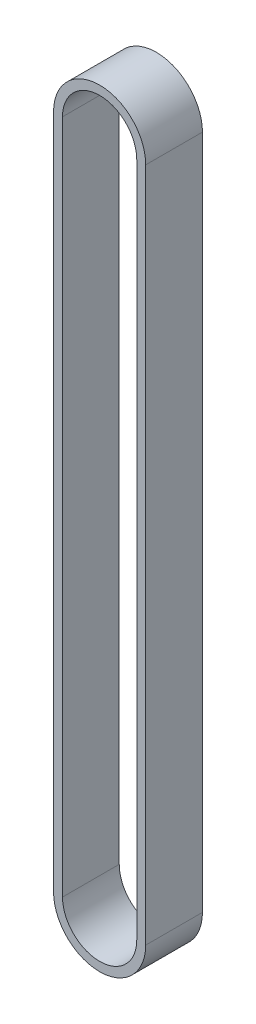
ISO-10303-21;
HEADER;
FILE_DESCRIPTION(('STEP AP214'),'2;1');
FILE_NAME('part.step','',(''),(''),'','','');
FILE_SCHEMA(('AUTOMOTIVE_DESIGN { 1 0 10303 214 1 1 1 1 }'));
ENDSEC;
DATA;
#1=APPLICATION_CONTEXT('core data for automotive mechanical design processes');
#2=APPLICATION_PROTOCOL_DEFINITION('international standard','automotive_design',2000,#1);
#3=PRODUCT_CONTEXT('',#1,'mechanical');
#4=PRODUCT('Part','Part','',(#3));
#5=PRODUCT_RELATED_PRODUCT_CATEGORY('part','',(#4));
#6=PRODUCT_DEFINITION_FORMATION('','',#4);
#7=PRODUCT_DEFINITION_CONTEXT('part definition',#1,'design');
#8=PRODUCT_DEFINITION('design','',#6,#7);
#9=PRODUCT_DEFINITION_SHAPE('','',#8);
#10=(LENGTH_UNIT() NAMED_UNIT(*) SI_UNIT(.MILLI.,.METRE.));
#11=(NAMED_UNIT(*) PLANE_ANGLE_UNIT() SI_UNIT($,.RADIAN.));
#12=(NAMED_UNIT(*) SI_UNIT($,.STERADIAN.) SOLID_ANGLE_UNIT());
#13=UNCERTAINTY_MEASURE_WITH_UNIT(LENGTH_MEASURE(1.E-05),#10,'distance_accuracy_value','');
#14=(GEOMETRIC_REPRESENTATION_CONTEXT(3) GLOBAL_UNCERTAINTY_ASSIGNED_CONTEXT((#13)) GLOBAL_UNIT_ASSIGNED_CONTEXT((#10,
#11,#12)) REPRESENTATION_CONTEXT('',''));
#15=CARTESIAN_POINT('',(0.,0.,0.));
#16=DIRECTION('',(0.,0.,1.));
#17=DIRECTION('',(1.,0.,0.));
#18=AXIS2_PLACEMENT_3D('',#15,#16,#17);
#19=CARTESIAN_POINT('',(0.,-113.143764563875,19.));
#20=DIRECTION('',(0.,0.,1.));
#21=DIRECTION('',(1.,0.,0.));
#22=AXIS2_PLACEMENT_3D('',#19,#20,#21);
#23=PLANE('',#22);
#24=CARTESIAN_POINT('',(0.,-113.143764563875,19.));
#25=DIRECTION('',(0.,0.,1.));
#26=DIRECTION('',(1.,0.,0.));
#27=AXIS2_PLACEMENT_3D('',#24,#25,#26);
#28=CIRCLE('',#27,15.4333);
#29=CARTESIAN_POINT('',(-15.4333,-113.143764563875,19.));
#30=VERTEX_POINT('',#29);
#31=CARTESIAN_POINT('',(15.4333,-113.143764563875,19.));
#32=VERTEX_POINT('',#31);
#33=EDGE_CURVE('E156',#30,#32,#28,.T.);
#34=ORIENTED_EDGE('',*,*,#33,.T.);
#35=DIRECTION('',(0.,1.,0.));
#36=VECTOR('',#35,1.);
#37=CARTESIAN_POINT('',(15.4333,-113.143764563875,19.));
#38=LINE('',#37,#36);
#39=CARTESIAN_POINT('',(15.4333,113.143764563875,19.));
#40=VERTEX_POINT('',#39);
#41=EDGE_CURVE('E160',#32,#40,#38,.T.);
#42=ORIENTED_EDGE('',*,*,#41,.T.);
#43=CARTESIAN_POINT('',(0.,113.143764563875,19.));
#44=DIRECTION('',(0.,0.,1.));
#45=DIRECTION('',(1.,0.,0.));
#46=AXIS2_PLACEMENT_3D('',#43,#44,#45);
#47=CIRCLE('',#46,15.4333);
#48=CARTESIAN_POINT('',(-15.4333,113.143764563875,19.));
#49=VERTEX_POINT('',#48);
#50=EDGE_CURVE('E164',#40,#49,#47,.T.);
#51=ORIENTED_EDGE('',*,*,#50,.T.);
#52=DIRECTION('',(0.,-1.,0.));
#53=VECTOR('',#52,1.);
#54=CARTESIAN_POINT('',(-15.4333,-113.143764563875,19.));
#55=LINE('',#54,#53);
#56=EDGE_CURVE('E167',#49,#30,#55,.T.);
#57=ORIENTED_EDGE('',*,*,#56,.T.);
#58=EDGE_LOOP('',(#34,#42,#51,#57));
#59=FACE_BOUND('',#58,.T.);
#60=DIRECTION('',(0.,1.,0.));
#61=VECTOR('',#60,1.);
#62=CARTESIAN_POINT('',(12.4333,-113.143764563875,19.));
#63=LINE('',#62,#61);
#64=CARTESIAN_POINT('',(12.4333,-113.143764563875,19.));
#65=VERTEX_POINT('',#64);
#66=CARTESIAN_POINT('',(12.4333,113.143764563875,19.));
#67=VERTEX_POINT('',#66);
#68=EDGE_CURVE('E115',#65,#67,#63,.T.);
#69=ORIENTED_EDGE('',*,*,#68,.F.);
#70=CARTESIAN_POINT('',(0.,-113.143764563875,19.));
#71=DIRECTION('',(0.,0.,1.));
#72=DIRECTION('',(1.,0.,0.));
#73=AXIS2_PLACEMENT_3D('',#70,#71,#72);
#74=CIRCLE('',#73,12.4333);
#75=CARTESIAN_POINT('',(-12.4333,-113.143764563875,19.));
#76=VERTEX_POINT('',#75);
#77=EDGE_CURVE('E106',#76,#65,#74,.T.);
#78=ORIENTED_EDGE('',*,*,#77,.F.);
#79=DIRECTION('',(0.,-1.,0.));
#80=VECTOR('',#79,1.);
#81=CARTESIAN_POINT('',(-12.4333,-113.143764563875,19.));
#82=LINE('',#81,#80);
#83=CARTESIAN_POINT('',(-12.4333000000001,113.143764563875,19.));
#84=VERTEX_POINT('',#83);
#85=EDGE_CURVE('E134',#84,#76,#82,.T.);
#86=ORIENTED_EDGE('',*,*,#85,.F.);
#87=CARTESIAN_POINT('',(0.,113.143764563875,19.));
#88=DIRECTION('',(0.,0.,1.));
#89=DIRECTION('',(1.,0.,0.));
#90=AXIS2_PLACEMENT_3D('',#87,#88,#89);
#91=CIRCLE('',#90,12.4333);
#92=EDGE_CURVE('E128',#67,#84,#91,.T.);
#93=ORIENTED_EDGE('',*,*,#92,.F.);
#94=EDGE_LOOP('',(#69,#78,#86,#93));
#95=FACE_BOUND('',#94,.T.);
#96=ADVANCED_FACE('F40',(#59,#95),#23,.T.);
#97=CARTESIAN_POINT('',(0.,-113.143764563875,0.));
#98=DIRECTION('',(0.,0.,1.));
#99=DIRECTION('',(1.,0.,0.));
#100=AXIS2_PLACEMENT_3D('',#97,#98,#99);
#101=PLANE('',#100);
#102=CARTESIAN_POINT('',(0.,-113.143764563875,0.));
#103=DIRECTION('',(0.,0.,1.));
#104=DIRECTION('',(1.,0.,0.));
#105=AXIS2_PLACEMENT_3D('',#102,#103,#104);
#106=CIRCLE('',#105,15.4333);
#107=CARTESIAN_POINT('',(-15.4333,-113.143764563875,0.));
#108=VERTEX_POINT('',#107);
#109=CARTESIAN_POINT('',(15.4333,-113.143764563875,0.));
#110=VERTEX_POINT('',#109);
#111=EDGE_CURVE('E124',#108,#110,#106,.T.);
#112=ORIENTED_EDGE('',*,*,#111,.F.);
#113=DIRECTION('',(0.,-1.,0.));
#114=VECTOR('',#113,1.);
#115=CARTESIAN_POINT('',(-15.4333,-113.143764563875,0.));
#116=LINE('',#115,#114);
#117=CARTESIAN_POINT('',(-15.4333,113.143764563875,0.));
#118=VERTEX_POINT('',#117);
#119=EDGE_CURVE('E161',#118,#108,#116,.T.);
#120=ORIENTED_EDGE('',*,*,#119,.F.);
#121=CARTESIAN_POINT('',(0.,113.143764563875,0.));
#122=DIRECTION('',(0.,0.,1.));
#123=DIRECTION('',(1.,0.,0.));
#124=AXIS2_PLACEMENT_3D('',#121,#122,#123);
#125=CIRCLE('',#124,15.4333);
#126=CARTESIAN_POINT('',(15.4333,113.143764563875,0.));
#127=VERTEX_POINT('',#126);
#128=EDGE_CURVE('E176',#127,#118,#125,.T.);
#129=ORIENTED_EDGE('',*,*,#128,.F.);
#130=DIRECTION('',(0.,1.,0.));
#131=VECTOR('',#130,1.);
#132=CARTESIAN_POINT('',(15.4333,-113.143764563875,0.));
#133=LINE('',#132,#131);
#134=EDGE_CURVE('E174',#110,#127,#133,.T.);
#135=ORIENTED_EDGE('',*,*,#134,.F.);
#136=EDGE_LOOP('',(#112,#120,#129,#135));
#137=FACE_BOUND('',#136,.T.);
#138=CARTESIAN_POINT('',(0.,-113.143764563875,0.));
#139=DIRECTION('',(0.,0.,1.));
#140=DIRECTION('',(1.,0.,0.));
#141=AXIS2_PLACEMENT_3D('',#138,#139,#140);
#142=CIRCLE('',#141,12.4333);
#143=CARTESIAN_POINT('',(-12.4333,-113.143764563875,0.));
#144=VERTEX_POINT('',#143);
#145=CARTESIAN_POINT('',(12.4333,-113.143764563875,0.));
#146=VERTEX_POINT('',#145);
#147=EDGE_CURVE('E64',#144,#146,#142,.T.);
#148=ORIENTED_EDGE('',*,*,#147,.T.);
#149=DIRECTION('',(0.,1.,0.));
#150=VECTOR('',#149,1.);
#151=CARTESIAN_POINT('',(12.4333,-113.143764563875,0.));
#152=LINE('',#151,#150);
#153=CARTESIAN_POINT('',(12.4333,113.143764563875,0.));
#154=VERTEX_POINT('',#153);
#155=EDGE_CURVE('E122',#146,#154,#152,.T.);
#156=ORIENTED_EDGE('',*,*,#155,.T.);
#157=CARTESIAN_POINT('',(0.,113.143764563875,0.));
#158=DIRECTION('',(0.,0.,1.));
#159=DIRECTION('',(1.,0.,0.));
#160=AXIS2_PLACEMENT_3D('',#157,#158,#159);
#161=CIRCLE('',#160,12.4333);
#162=CARTESIAN_POINT('',(-12.4333000000001,113.143764563875,0.));
#163=VERTEX_POINT('',#162);
#164=EDGE_CURVE('E143',#154,#163,#161,.T.);
#165=ORIENTED_EDGE('',*,*,#164,.T.);
#166=DIRECTION('',(0.,-1.,0.));
#167=VECTOR('',#166,1.);
#168=CARTESIAN_POINT('',(-12.4333,-113.143764563875,0.));
#169=LINE('',#168,#167);
#170=EDGE_CURVE('E116',#163,#144,#169,.T.);
#171=ORIENTED_EDGE('',*,*,#170,.T.);
#172=EDGE_LOOP('',(#148,#156,#165,#171));
#173=FACE_BOUND('',#172,.T.);
#174=ADVANCED_FACE('F198',(#137,#173),#101,.F.);
#175=CARTESIAN_POINT('',(0.,-113.143764563875,19.));
#176=DIRECTION('',(0.,0.,-1.));
#177=DIRECTION('',(-1.,0.,0.));
#178=AXIS2_PLACEMENT_3D('',#175,#176,#177);
#179=CYLINDRICAL_SURFACE('',#178,15.4333);
#180=ORIENTED_EDGE('',*,*,#111,.T.);
#181=DIRECTION('',(0.,0.,-1.));
#182=VECTOR('',#181,1.);
#183=CARTESIAN_POINT('',(15.4333,-113.143764563875,19.));
#184=LINE('',#183,#182);
#185=EDGE_CURVE('E11',#32,#110,#184,.T.);
#186=ORIENTED_EDGE('',*,*,#185,.F.);
#187=ORIENTED_EDGE('',*,*,#33,.F.);
#188=DIRECTION('',(0.,0.,-1.));
#189=VECTOR('',#188,1.);
#190=CARTESIAN_POINT('',(-15.4333,-113.143764563875,19.));
#191=LINE('',#190,#189);
#192=EDGE_CURVE('E170',#30,#108,#191,.T.);
#193=ORIENTED_EDGE('',*,*,#192,.T.);
#194=EDGE_LOOP('',(#180,#186,#187,#193));
#195=FACE_BOUND('',#194,.T.);
#196=ADVANCED_FACE('F42',(#195),#179,.T.);
#197=CARTESIAN_POINT('',(15.4333,-113.143764563875,19.));
#198=DIRECTION('',(-1.,0.,0.));
#199=DIRECTION('',(0.,0.,1.));
#200=AXIS2_PLACEMENT_3D('',#197,#198,#199);
#201=PLANE('',#200);
#202=ORIENTED_EDGE('',*,*,#134,.T.);
#203=DIRECTION('',(0.,0.,-1.));
#204=VECTOR('',#203,1.);
#205=CARTESIAN_POINT('',(15.4333,113.143764563875,19.));
#206=LINE('',#205,#204);
#207=EDGE_CURVE('E49',#40,#127,#206,.T.);
#208=ORIENTED_EDGE('',*,*,#207,.F.);
#209=ORIENTED_EDGE('',*,*,#41,.F.);
#210=ORIENTED_EDGE('',*,*,#185,.T.);
#211=EDGE_LOOP('',(#202,#208,#209,#210));
#212=FACE_BOUND('',#211,.T.);
#213=ADVANCED_FACE('F208',(#212),#201,.F.);
#214=CARTESIAN_POINT('',(0.,113.143764563875,19.));
#215=DIRECTION('',(0.,0.,-1.));
#216=DIRECTION('',(-1.,0.,0.));
#217=AXIS2_PLACEMENT_3D('',#214,#215,#216);
#218=CYLINDRICAL_SURFACE('',#217,15.4333);
#219=ORIENTED_EDGE('',*,*,#128,.T.);
#220=DIRECTION('',(0.,0.,-1.));
#221=VECTOR('',#220,1.);
#222=CARTESIAN_POINT('',(-15.4333,113.143764563875,19.));
#223=LINE('',#222,#221);
#224=EDGE_CURVE('E183',#49,#118,#223,.T.);
#225=ORIENTED_EDGE('',*,*,#224,.F.);
#226=ORIENTED_EDGE('',*,*,#50,.F.);
#227=ORIENTED_EDGE('',*,*,#207,.T.);
#228=EDGE_LOOP('',(#219,#225,#226,#227));
#229=FACE_BOUND('',#228,.T.);
#230=ADVANCED_FACE('F192',(#229),#218,.T.);
#231=CARTESIAN_POINT('',(-15.4333,-113.143764563875,19.));
#232=DIRECTION('',(1.,0.,0.));
#233=DIRECTION('',(0.,0.,-1.));
#234=AXIS2_PLACEMENT_3D('',#231,#232,#233);
#235=PLANE('',#234);
#236=ORIENTED_EDGE('',*,*,#119,.T.);
#237=ORIENTED_EDGE('',*,*,#192,.F.);
#238=ORIENTED_EDGE('',*,*,#56,.F.);
#239=ORIENTED_EDGE('',*,*,#224,.T.);
#240=EDGE_LOOP('',(#236,#237,#238,#239));
#241=FACE_BOUND('',#240,.T.);
#242=ADVANCED_FACE('F202',(#241),#235,.F.);
#243=CARTESIAN_POINT('',(0.,-113.143764563875,19.));
#244=DIRECTION('',(0.,0.,-1.));
#245=DIRECTION('',(-1.,0.,0.));
#246=AXIS2_PLACEMENT_3D('',#243,#244,#245);
#247=CYLINDRICAL_SURFACE('',#246,12.4333);
#248=ORIENTED_EDGE('',*,*,#147,.F.);
#249=DIRECTION('',(0.,0.,-1.));
#250=VECTOR('',#249,1.);
#251=CARTESIAN_POINT('',(-12.4333,-113.143764563875,19.));
#252=LINE('',#251,#250);
#253=EDGE_CURVE('E110',#76,#144,#252,.T.);
#254=ORIENTED_EDGE('',*,*,#253,.F.);
#255=ORIENTED_EDGE('',*,*,#77,.T.);
#256=DIRECTION('',(0.,0.,-1.));
#257=VECTOR('',#256,1.);
#258=CARTESIAN_POINT('',(12.4333,-113.143764563875,19.));
#259=LINE('',#258,#257);
#260=EDGE_CURVE('E109',#65,#146,#259,.T.);
#261=ORIENTED_EDGE('',*,*,#260,.T.);
#262=EDGE_LOOP('',(#248,#254,#255,#261));
#263=FACE_BOUND('',#262,.T.);
#264=ADVANCED_FACE('F108',(#263),#247,.F.);
#265=CARTESIAN_POINT('',(12.4333,-113.143764563875,19.));
#266=DIRECTION('',(-1.,0.,0.));
#267=DIRECTION('',(0.,-1.,0.));
#268=AXIS2_PLACEMENT_3D('',#265,#266,#267);
#269=PLANE('',#268);
#270=ORIENTED_EDGE('',*,*,#155,.F.);
#271=ORIENTED_EDGE('',*,*,#260,.F.);
#272=ORIENTED_EDGE('',*,*,#68,.T.);
#273=DIRECTION('',(0.,0.,-1.));
#274=VECTOR('',#273,1.);
#275=CARTESIAN_POINT('',(12.4333,113.143764563875,19.));
#276=LINE('',#275,#274);
#277=EDGE_CURVE('E125',#67,#154,#276,.T.);
#278=ORIENTED_EDGE('',*,*,#277,.T.);
#279=EDGE_LOOP('',(#270,#271,#272,#278));
#280=FACE_BOUND('',#279,.T.);
#281=ADVANCED_FACE('F119',(#280),#269,.T.);
#282=CARTESIAN_POINT('',(0.,113.143764563875,19.));
#283=DIRECTION('',(0.,0.,-1.));
#284=DIRECTION('',(-1.,0.,0.));
#285=AXIS2_PLACEMENT_3D('',#282,#283,#284);
#286=CYLINDRICAL_SURFACE('',#285,12.4333);
#287=ORIENTED_EDGE('',*,*,#164,.F.);
#288=ORIENTED_EDGE('',*,*,#277,.F.);
#289=ORIENTED_EDGE('',*,*,#92,.T.);
#290=DIRECTION('',(0.,0.,-1.));
#291=VECTOR('',#290,1.);
#292=CARTESIAN_POINT('',(-12.4333000000001,113.143764563875,19.));
#293=LINE('',#292,#291);
#294=EDGE_CURVE('E56',#84,#163,#293,.T.);
#295=ORIENTED_EDGE('',*,*,#294,.T.);
#296=EDGE_LOOP('',(#287,#288,#289,#295));
#297=FACE_BOUND('',#296,.T.);
#298=ADVANCED_FACE('F231',(#297),#286,.F.);
#299=CARTESIAN_POINT('',(-12.4333,-113.143764563875,19.));
#300=DIRECTION('',(1.,0.,0.));
#301=DIRECTION('',(0.,1.,0.));
#302=AXIS2_PLACEMENT_3D('',#299,#300,#301);
#303=PLANE('',#302);
#304=ORIENTED_EDGE('',*,*,#170,.F.);
#305=ORIENTED_EDGE('',*,*,#294,.F.);
#306=ORIENTED_EDGE('',*,*,#85,.T.);
#307=ORIENTED_EDGE('',*,*,#253,.T.);
#308=EDGE_LOOP('',(#304,#305,#306,#307));
#309=FACE_BOUND('',#308,.T.);
#310=ADVANCED_FACE('F235',(#309),#303,.T.);
#311=CLOSED_SHELL('',(#96,#174,#196,#213,#230,#242,#264,#281,#298,#310));
#312=MANIFOLD_SOLID_BREP('B2',#311);
#313=ADVANCED_BREP_SHAPE_REPRESENTATION('',(#18,#312),#14);
#314=SHAPE_DEFINITION_REPRESENTATION(#9,#313);
ENDSEC;
END-ISO-10303-21;
